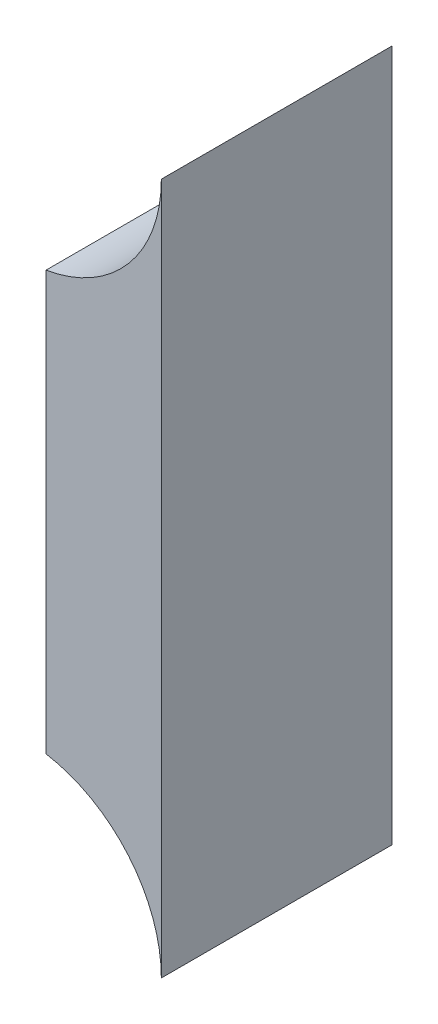
ISO-10303-21;
HEADER;
FILE_DESCRIPTION(('STEP AP214'),'2;1');
FILE_NAME('part.step','',(''),(''),'','','');
FILE_SCHEMA(('AUTOMOTIVE_DESIGN { 1 0 10303 214 1 1 1 1 }'));
ENDSEC;
DATA;
#1=APPLICATION_CONTEXT('core data for automotive mechanical design processes');
#2=APPLICATION_PROTOCOL_DEFINITION('international standard','automotive_design',2000,#1);
#3=PRODUCT_CONTEXT('',#1,'mechanical');
#4=PRODUCT('Part','Part','',(#3));
#5=PRODUCT_RELATED_PRODUCT_CATEGORY('part','',(#4));
#6=PRODUCT_DEFINITION_FORMATION('','',#4);
#7=PRODUCT_DEFINITION_CONTEXT('part definition',#1,'design');
#8=PRODUCT_DEFINITION('design','',#6,#7);
#9=PRODUCT_DEFINITION_SHAPE('','',#8);
#10=(LENGTH_UNIT() NAMED_UNIT(*) SI_UNIT(.MILLI.,.METRE.));
#11=(NAMED_UNIT(*) PLANE_ANGLE_UNIT() SI_UNIT($,.RADIAN.));
#12=(NAMED_UNIT(*) SI_UNIT($,.STERADIAN.) SOLID_ANGLE_UNIT());
#13=UNCERTAINTY_MEASURE_WITH_UNIT(LENGTH_MEASURE(1.E-05),#10,'distance_accuracy_value','');
#14=(GEOMETRIC_REPRESENTATION_CONTEXT(3) GLOBAL_UNCERTAINTY_ASSIGNED_CONTEXT((#13)) GLOBAL_UNIT_ASSIGNED_CONTEXT((#10,
#11,#12)) REPRESENTATION_CONTEXT('',''));
#15=CARTESIAN_POINT('',(0.,0.,0.));
#16=DIRECTION('',(0.,0.,1.));
#17=DIRECTION('',(1.,0.,0.));
#18=AXIS2_PLACEMENT_3D('',#15,#16,#17);
#19=CARTESIAN_POINT('',(-0.545000000000576,15.2786796564406,0.5));
#20=DIRECTION('',(0.,0.,-1.));
#21=DIRECTION('',(-1.,0.,0.));
#22=AXIS2_PLACEMENT_3D('',#19,#20,#21);
#23=CYLINDRICAL_SURFACE('',#22,0.299999999999987);
#24=CARTESIAN_POINT('',(-0.545000000000576,15.2786796564406,0.));
#25=DIRECTION('',(0.,0.,1.));
#26=DIRECTION('',(1.,0.,0.));
#27=AXIS2_PLACEMENT_3D('',#24,#25,#26);
#28=CIRCLE('',#27,0.299999999999987);
#29=CARTESIAN_POINT('',(-0.245000000000586,15.2786796564405,0.));
#30=VERTEX_POINT('',#29);
#31=CARTESIAN_POINT('',(-0.495000000000879,15.5744836455957,0.));
#32=VERTEX_POINT('',#31);
#33=EDGE_CURVE('E11',#30,#32,#28,.T.);
#34=ORIENTED_EDGE('',*,*,#33,.F.);
#35=DIRECTION('',(0.,0.,-1.));
#36=VECTOR('',#35,1.);
#37=CARTESIAN_POINT('',(-0.245000000000586,15.2786796564405,0.5));
#38=LINE('',#37,#36);
#39=CARTESIAN_POINT('',(-0.245000000000586,15.2786796564405,0.5));
#40=VERTEX_POINT('',#39);
#41=EDGE_CURVE('E24',#40,#30,#38,.T.);
#42=ORIENTED_EDGE('',*,*,#41,.F.);
#43=CARTESIAN_POINT('',(-0.545000000000576,15.2786796564406,0.5));
#44=DIRECTION('',(0.,0.,1.));
#45=DIRECTION('',(1.,0.,0.));
#46=AXIS2_PLACEMENT_3D('',#43,#44,#45);
#47=CIRCLE('',#46,0.299999999999987);
#48=CARTESIAN_POINT('',(-0.495000000000879,15.5744836455957,0.5));
#49=VERTEX_POINT('',#48);
#50=EDGE_CURVE('E88',#40,#49,#47,.T.);
#51=ORIENTED_EDGE('',*,*,#50,.T.);
#52=DIRECTION('',(0.,0.,-1.));
#53=VECTOR('',#52,1.);
#54=CARTESIAN_POINT('',(-0.495000000000879,15.5744836455957,0.5));
#55=LINE('',#54,#53);
#56=EDGE_CURVE('E37',#49,#32,#55,.T.);
#57=ORIENTED_EDGE('',*,*,#56,.T.);
#58=EDGE_LOOP('',(#34,#42,#51,#57));
#59=FACE_BOUND('',#58,.T.);
#60=ADVANCED_FACE('F17',(#59),#23,.F.);
#61=CARTESIAN_POINT('',(-0.245000000000545,0.,0.5));
#62=DIRECTION('',(1.,0.,0.));
#63=DIRECTION('',(0.,1.,0.));
#64=AXIS2_PLACEMENT_3D('',#61,#62,#63);
#65=PLANE('',#64);
#66=DIRECTION('',(0.,-1.,0.));
#67=VECTOR('',#66,1.);
#68=CARTESIAN_POINT('',(-0.245000000000545,0.,0.));
#69=LINE('',#68,#67);
#70=CARTESIAN_POINT('',(-0.24500000000059,16.7786796564379,0.));
#71=VERTEX_POINT('',#70);
#72=EDGE_CURVE('E84',#71,#30,#69,.T.);
#73=ORIENTED_EDGE('',*,*,#72,.F.);
#74=DIRECTION('',(0.,0.,-1.));
#75=VECTOR('',#74,1.);
#76=CARTESIAN_POINT('',(-0.24500000000059,16.7786796564379,0.5));
#77=LINE('',#76,#75);
#78=CARTESIAN_POINT('',(-0.24500000000059,16.7786796564379,0.5));
#79=VERTEX_POINT('',#78);
#80=EDGE_CURVE('E82',#79,#71,#77,.T.);
#81=ORIENTED_EDGE('',*,*,#80,.F.);
#82=DIRECTION('',(0.,-1.,0.));
#83=VECTOR('',#82,1.);
#84=CARTESIAN_POINT('',(-0.245000000000545,0.,0.5));
#85=LINE('',#84,#83);
#86=EDGE_CURVE('E62',#79,#40,#85,.T.);
#87=ORIENTED_EDGE('',*,*,#86,.T.);
#88=ORIENTED_EDGE('',*,*,#41,.T.);
#89=EDGE_LOOP('',(#73,#81,#87,#88));
#90=FACE_BOUND('',#89,.T.);
#91=ADVANCED_FACE('F89',(#90),#65,.T.);
#92=CARTESIAN_POINT('',(-0.545000000000785,16.7786796564415,0.5));
#93=DIRECTION('',(0.,0.,-1.));
#94=DIRECTION('',(-1.,0.,0.));
#95=AXIS2_PLACEMENT_3D('',#92,#93,#94);
#96=CYLINDRICAL_SURFACE('',#95,0.300000000000196);
#97=CARTESIAN_POINT('',(-0.545000000000785,16.7786796564415,0.));
#98=DIRECTION('',(0.,0.,1.));
#99=DIRECTION('',(1.,0.,0.));
#100=AXIS2_PLACEMENT_3D('',#97,#98,#99);
#101=CIRCLE('',#100,0.300000000000196);
#102=CARTESIAN_POINT('',(-0.495000000000879,16.4828756672864,0.));
#103=VERTEX_POINT('',#102);
#104=EDGE_CURVE('E71',#103,#71,#101,.T.);
#105=ORIENTED_EDGE('',*,*,#104,.F.);
#106=DIRECTION('',(0.,0.,-1.));
#107=VECTOR('',#106,1.);
#108=CARTESIAN_POINT('',(-0.495000000000879,16.4828756672864,0.5));
#109=LINE('',#108,#107);
#110=CARTESIAN_POINT('',(-0.495000000000879,16.4828756672864,0.5));
#111=VERTEX_POINT('',#110);
#112=EDGE_CURVE('E65',#111,#103,#109,.T.);
#113=ORIENTED_EDGE('',*,*,#112,.F.);
#114=CARTESIAN_POINT('',(-0.545000000000785,16.7786796564415,0.5));
#115=DIRECTION('',(0.,0.,1.));
#116=DIRECTION('',(1.,0.,0.));
#117=AXIS2_PLACEMENT_3D('',#114,#115,#116);
#118=CIRCLE('',#117,0.300000000000196);
#119=EDGE_CURVE('E57',#111,#79,#118,.T.);
#120=ORIENTED_EDGE('',*,*,#119,.T.);
#121=ORIENTED_EDGE('',*,*,#80,.T.);
#122=EDGE_LOOP('',(#105,#113,#120,#121));
#123=FACE_BOUND('',#122,.T.);
#124=ADVANCED_FACE('F69',(#123),#96,.F.);
#125=CARTESIAN_POINT('',(-0.495000000000887,0.,0.5));
#126=DIRECTION('',(1.,0.,0.));
#127=DIRECTION('',(0.,1.,0.));
#128=AXIS2_PLACEMENT_3D('',#125,#126,#127);
#129=PLANE('',#128);
#130=DIRECTION('',(0.,-1.,0.));
#131=VECTOR('',#130,1.);
#132=CARTESIAN_POINT('',(-0.495000000000887,0.,0.));
#133=LINE('',#132,#131);
#134=EDGE_CURVE('E66',#103,#32,#133,.T.);
#135=ORIENTED_EDGE('',*,*,#134,.T.);
#136=ORIENTED_EDGE('',*,*,#56,.F.);
#137=DIRECTION('',(0.,-1.,0.));
#138=VECTOR('',#137,1.);
#139=CARTESIAN_POINT('',(-0.495000000000887,0.,0.5));
#140=LINE('',#139,#138);
#141=EDGE_CURVE('E61',#111,#49,#140,.T.);
#142=ORIENTED_EDGE('',*,*,#141,.F.);
#143=ORIENTED_EDGE('',*,*,#112,.T.);
#144=EDGE_LOOP('',(#135,#136,#142,#143));
#145=FACE_BOUND('',#144,.T.);
#146=ADVANCED_FACE('F76',(#145),#129,.F.);
#147=CARTESIAN_POINT('',(0.,0.,0.5));
#148=DIRECTION('',(0.,0.,1.));
#149=DIRECTION('',(1.,0.,0.));
#150=AXIS2_PLACEMENT_3D('',#147,#148,#149);
#151=PLANE('',#150);
#152=ORIENTED_EDGE('',*,*,#50,.F.);
#153=ORIENTED_EDGE('',*,*,#86,.F.);
#154=ORIENTED_EDGE('',*,*,#119,.F.);
#155=ORIENTED_EDGE('',*,*,#141,.T.);
#156=EDGE_LOOP('',(#152,#153,#154,#155));
#157=FACE_BOUND('',#156,.T.);
#158=ADVANCED_FACE('F59',(#157),#151,.T.);
#159=CARTESIAN_POINT('',(0.,0.,0.));
#160=DIRECTION('',(0.,0.,1.));
#161=DIRECTION('',(1.,0.,0.));
#162=AXIS2_PLACEMENT_3D('',#159,#160,#161);
#163=PLANE('',#162);
#164=ORIENTED_EDGE('',*,*,#33,.T.);
#165=ORIENTED_EDGE('',*,*,#134,.F.);
#166=ORIENTED_EDGE('',*,*,#104,.T.);
#167=ORIENTED_EDGE('',*,*,#72,.T.);
#168=EDGE_LOOP('',(#164,#165,#166,#167));
#169=FACE_BOUND('',#168,.T.);
#170=ADVANCED_FACE('F91',(#169),#163,.F.);
#171=CLOSED_SHELL('',(#60,#91,#124,#146,#158,#170));
#172=MANIFOLD_SOLID_BREP('B1',#171);
#173=ADVANCED_BREP_SHAPE_REPRESENTATION('',(#18,#172),#14);
#174=SHAPE_DEFINITION_REPRESENTATION(#9,#173);
ENDSEC;
END-ISO-10303-21;
